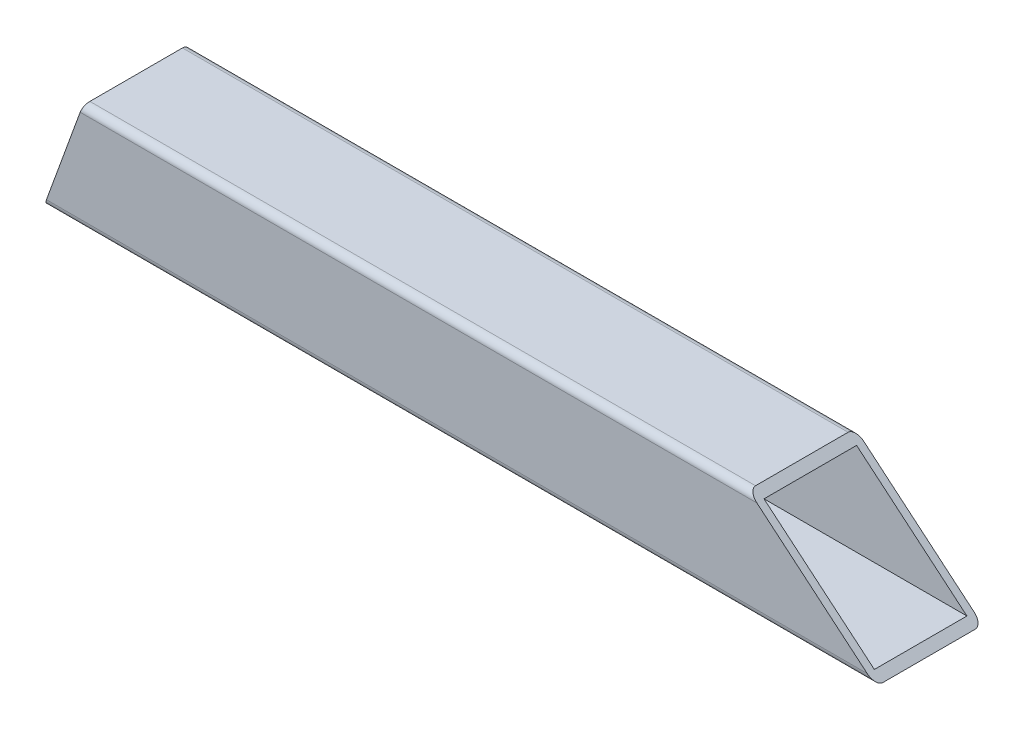
ISO-10303-21;
HEADER;
FILE_DESCRIPTION(('STEP AP214'),'2;1');
FILE_NAME('part.step','',(''),(''),'','','');
FILE_SCHEMA(('AUTOMOTIVE_DESIGN { 1 0 10303 214 1 1 1 1 }'));
ENDSEC;
DATA;
#1=APPLICATION_CONTEXT('core data for automotive mechanical design processes');
#2=APPLICATION_PROTOCOL_DEFINITION('international standard','automotive_design',2000,#1);
#3=PRODUCT_CONTEXT('',#1,'mechanical');
#4=PRODUCT('Part','Part','',(#3));
#5=PRODUCT_RELATED_PRODUCT_CATEGORY('part','',(#4));
#6=PRODUCT_DEFINITION_FORMATION('','',#4);
#7=PRODUCT_DEFINITION_CONTEXT('part definition',#1,'design');
#8=PRODUCT_DEFINITION('design','',#6,#7);
#9=PRODUCT_DEFINITION_SHAPE('','',#8);
#10=(LENGTH_UNIT() NAMED_UNIT(*) SI_UNIT(.MILLI.,.METRE.));
#11=(NAMED_UNIT(*) PLANE_ANGLE_UNIT() SI_UNIT($,.RADIAN.));
#12=(NAMED_UNIT(*) SI_UNIT($,.STERADIAN.) SOLID_ANGLE_UNIT());
#13=UNCERTAINTY_MEASURE_WITH_UNIT(LENGTH_MEASURE(1.E-05),#10,'distance_accuracy_value','');
#14=(GEOMETRIC_REPRESENTATION_CONTEXT(3) GLOBAL_UNCERTAINTY_ASSIGNED_CONTEXT((#13)) GLOBAL_UNIT_ASSIGNED_CONTEXT((#10,
#11,#12)) REPRESENTATION_CONTEXT('',''));
#15=CARTESIAN_POINT('',(0.,0.,0.));
#16=DIRECTION('',(0.,0.,1.));
#17=DIRECTION('',(1.,0.,0.));
#18=AXIS2_PLACEMENT_3D('',#15,#16,#17);
#19=CARTESIAN_POINT('',(1168.00000000001,140.,-9.99999999999979));
#20=DIRECTION('',(-1.00000000000001,0.,0.));
#21=DIRECTION('',(0.,0.,1.));
#22=AXIS2_PLACEMENT_3D('',#19,#20,#21);
#23=CYLINDRICAL_SURFACE('',#22,10.);
#24=CARTESIAN_POINT('',(50.9558327972691,140.,-9.99999999999979));
#25=DIRECTION('',(-0.939692620785912,0.342020143325675,0.));
#26=DIRECTION('',(-0.342020143325674,-0.93969262078591,0.));
#27=AXIS2_PLACEMENT_3D('',#24,#25,#26);
#28=ELLIPSE('',#27,10.6417777247591,10.);
#29=CARTESIAN_POINT('',(50.9558327972691,140.,2.22044604925031E-13));
#30=VERTEX_POINT('',#29);
#31=CARTESIAN_POINT('',(54.5955351399319,150.,-10.0000000000001));
#32=VERTEX_POINT('',#31);
#33=EDGE_CURVE('E48',#30,#32,#28,.T.);
#34=ORIENTED_EDGE('',*,*,#33,.F.);
#35=DIRECTION('',(-1.00000000000001,0.,0.));
#36=VECTOR('',#35,1.);
#37=CARTESIAN_POINT('',(1168.00000000001,140.,2.22044604925031E-13));
#38=LINE('',#37,#36);
#39=CARTESIAN_POINT('',(1001.15449703682,139.999999999999,0.));
#40=VERTEX_POINT('',#39);
#41=EDGE_CURVE('E223',#40,#30,#38,.T.);
#42=ORIENTED_EDGE('',*,*,#41,.F.);
#43=CARTESIAN_POINT('',(1001.15449703682,139.999999999999,-9.99999999999995));
#44=DIRECTION('',(-0.642787609686544,-0.766044443118979,0.));
#45=DIRECTION('',(-0.766044443118981,0.642787609686544,0.));
#46=AXIS2_PLACEMENT_3D('',#43,#44,#45);
#47=ELLIPSE('',#46,15.5572382686041,10.);
#48=CARTESIAN_POINT('',(989.236961110875,149.999999999999,-10.0000000000002));
#49=VERTEX_POINT('',#48);
#50=EDGE_CURVE('E191',#40,#49,#47,.T.);
#51=ORIENTED_EDGE('',*,*,#50,.T.);
#52=DIRECTION('',(-1.00000000000001,0.,0.));
#53=VECTOR('',#52,1.);
#54=CARTESIAN_POINT('',(1168.00000000001,149.999999999999,-9.99999999999984));
#55=LINE('',#54,#53);
#56=EDGE_CURVE('E135',#49,#32,#55,.T.);
#57=ORIENTED_EDGE('',*,*,#56,.T.);
#58=EDGE_LOOP('',(#34,#42,#51,#57));
#59=FACE_BOUND('',#58,.T.);
#60=ADVANCED_FACE('F34',(#59),#23,.T.);
#61=CARTESIAN_POINT('',(1168.00000000001,9.99999999999801,0.));
#62=DIRECTION('',(0.,0.,-1.));
#63=DIRECTION('',(-1.00000000000001,0.,0.));
#64=AXIS2_PLACEMENT_3D('',#61,#62,#63);
#65=PLANE('',#64);
#66=DIRECTION('',(0.342020143325674,0.93969262078591,0.));
#67=VECTOR('',#66,1.);
#68=CARTESIAN_POINT('',(139.843983266953,384.218186272538,0.));
#69=LINE('',#68,#67);
#70=CARTESIAN_POINT('',(3.63970234266242,9.9999999999989,2.22044604925031E-13));
#71=VERTEX_POINT('',#70);
#72=EDGE_CURVE('E55',#71,#30,#69,.T.);
#73=ORIENTED_EDGE('',*,*,#72,.F.);
#74=DIRECTION('',(-1.00000000000001,0.,0.));
#75=VECTOR('',#74,1.);
#76=CARTESIAN_POINT('',(1168.00000000001,9.99999999999801,0.));
#77=LINE('',#76,#75);
#78=CARTESIAN_POINT('',(1156.08246407406,9.99999999999801,0.));
#79=VERTEX_POINT('',#78);
#80=EDGE_CURVE('E221',#79,#71,#77,.T.);
#81=ORIENTED_EDGE('',*,*,#80,.F.);
#82=DIRECTION('',(-0.766044443118981,0.642787609686544,0.));
#83=VECTOR('',#82,1.);
#84=CARTESIAN_POINT('',(1163.07596123495,4.13175911166408,0.));
#85=LINE('',#84,#83);
#86=EDGE_CURVE('E188',#79,#40,#85,.T.);
#87=ORIENTED_EDGE('',*,*,#86,.T.);
#88=ORIENTED_EDGE('',*,*,#41,.T.);
#89=EDGE_LOOP('',(#73,#81,#87,#88));
#90=FACE_BOUND('',#89,.T.);
#91=ADVANCED_FACE('F251',(#90),#65,.F.);
#92=CARTESIAN_POINT('',(1168.00000000001,9.99999999999801,-10.));
#93=DIRECTION('',(-1.00000000000001,0.,0.));
#94=DIRECTION('',(0.,0.,1.));
#95=AXIS2_PLACEMENT_3D('',#92,#93,#94);
#96=CYLINDRICAL_SURFACE('',#95,10.);
#97=CARTESIAN_POINT('',(3.63970234266242,9.9999999999989,-9.99999999999979));
#98=DIRECTION('',(-0.939692620785912,0.342020143325675,0.));
#99=DIRECTION('',(-0.342020143325674,-0.93969262078591,0.));
#100=AXIS2_PLACEMENT_3D('',#97,#98,#99);
#101=ELLIPSE('',#100,10.6417777247591,10.);
#102=CARTESIAN_POINT('',(0.,0.,-10.0000000000001));
#103=VERTEX_POINT('',#102);
#104=EDGE_CURVE('E162',#103,#71,#101,.T.);
#105=ORIENTED_EDGE('',*,*,#104,.F.);
#106=DIRECTION('',(-1.00000000000001,0.,0.));
#107=VECTOR('',#106,1.);
#108=CARTESIAN_POINT('',(1168.00000000001,-1.77635683940025E-12,-10.0000000000003));
#109=LINE('',#108,#107);
#110=CARTESIAN_POINT('',(1168.00000000001,-1.77635683940025E-12,-10.0000000000002));
#111=VERTEX_POINT('',#110);
#112=EDGE_CURVE('E218',#111,#103,#109,.T.);
#113=ORIENTED_EDGE('',*,*,#112,.F.);
#114=CARTESIAN_POINT('',(1156.08246407406,9.99999999999845,-10.));
#115=DIRECTION('',(-0.642787609686544,-0.766044443118979,0.));
#116=DIRECTION('',(-0.766044443118981,0.642787609686544,0.));
#117=AXIS2_PLACEMENT_3D('',#114,#115,#116);
#118=ELLIPSE('',#117,15.5572382686041,10.);
#119=EDGE_CURVE('E185',#111,#79,#118,.T.);
#120=ORIENTED_EDGE('',*,*,#119,.T.);
#121=ORIENTED_EDGE('',*,*,#80,.T.);
#122=EDGE_LOOP('',(#105,#113,#120,#121));
#123=FACE_BOUND('',#122,.T.);
#124=ADVANCED_FACE('F255',(#123),#96,.T.);
#125=CARTESIAN_POINT('',(1168.00000000001,9.99999999999779,-140.000000000001));
#126=DIRECTION('',(-1.00000000000001,0.,0.));
#127=DIRECTION('',(0.,0.,1.));
#128=AXIS2_PLACEMENT_3D('',#125,#126,#127);
#129=CYLINDRICAL_SURFACE('',#128,10.);
#130=CARTESIAN_POINT('',(3.63970234266242,9.9999999999989,-140.));
#131=DIRECTION('',(-0.939692620785912,0.342020143325675,0.));
#132=DIRECTION('',(-0.342020143325674,-0.93969262078591,0.));
#133=AXIS2_PLACEMENT_3D('',#130,#131,#132);
#134=ELLIPSE('',#133,10.6417777247591,10.);
#135=CARTESIAN_POINT('',(3.63970234266242,9.9999999999989,-150.));
#136=VERTEX_POINT('',#135);
#137=CARTESIAN_POINT('',(2.22044604925031E-13,-8.88178419700125E-13,-140.));
#138=VERTEX_POINT('',#137);
#139=EDGE_CURVE('E159',#136,#138,#134,.T.);
#140=ORIENTED_EDGE('',*,*,#139,.F.);
#141=DIRECTION('',(-1.00000000000001,0.,0.));
#142=VECTOR('',#141,1.);
#143=CARTESIAN_POINT('',(1168.00000000001,9.99999999999801,-150.000000000001));
#144=LINE('',#143,#142);
#145=CARTESIAN_POINT('',(1156.08246407406,9.99999999999823,-150.));
#146=VERTEX_POINT('',#145);
#147=EDGE_CURVE('E212',#146,#136,#144,.T.);
#148=ORIENTED_EDGE('',*,*,#147,.F.);
#149=CARTESIAN_POINT('',(1156.08246407406,9.99999999999868,-140.));
#150=DIRECTION('',(-0.642787609686544,-0.766044443118979,0.));
#151=DIRECTION('',(-0.766044443118981,0.642787609686544,0.));
#152=AXIS2_PLACEMENT_3D('',#149,#150,#151);
#153=ELLIPSE('',#152,15.5572382686041,10.);
#154=CARTESIAN_POINT('',(1168.00000000001,-1.99840144432528E-12,-140.));
#155=VERTEX_POINT('',#154);
#156=EDGE_CURVE('E182',#146,#155,#153,.T.);
#157=ORIENTED_EDGE('',*,*,#156,.T.);
#158=DIRECTION('',(-1.00000000000001,0.,0.));
#159=VECTOR('',#158,1.);
#160=CARTESIAN_POINT('',(1168.00000000001,-1.99840144432528E-12,-140.));
#161=LINE('',#160,#159);
#162=EDGE_CURVE('E215',#155,#138,#161,.T.);
#163=ORIENTED_EDGE('',*,*,#162,.T.);
#164=EDGE_LOOP('',(#140,#148,#157,#163));
#165=FACE_BOUND('',#164,.T.);
#166=ADVANCED_FACE('F259',(#165),#129,.T.);
#167=CARTESIAN_POINT('',(1168.00000000001,9.99999999999801,-150.000000000001));
#168=DIRECTION('',(0.,0.,1.));
#169=DIRECTION('',(1.00000000000001,0.,0.));
#170=AXIS2_PLACEMENT_3D('',#167,#168,#169);
#171=PLANE('',#170);
#172=DIRECTION('',(-0.342020143325674,-0.93969262078591,0.));
#173=VECTOR('',#172,1.);
#174=CARTESIAN_POINT('',(139.843983266953,384.218186272538,-150.));
#175=LINE('',#174,#173);
#176=CARTESIAN_POINT('',(50.9558327972699,139.999999999999,-150.));
#177=VERTEX_POINT('',#176);
#178=EDGE_CURVE('E144',#177,#136,#175,.T.);
#179=ORIENTED_EDGE('',*,*,#178,.F.);
#180=DIRECTION('',(-1.00000000000001,0.,0.));
#181=VECTOR('',#180,1.);
#182=CARTESIAN_POINT('',(1168.00000000001,139.999999999999,-150.));
#183=LINE('',#182,#181);
#184=CARTESIAN_POINT('',(1001.15449703682,139.999999999999,-150.));
#185=VERTEX_POINT('',#184);
#186=EDGE_CURVE('E134',#185,#177,#183,.T.);
#187=ORIENTED_EDGE('',*,*,#186,.F.);
#188=DIRECTION('',(0.766044443118981,-0.642787609686544,0.));
#189=VECTOR('',#188,1.);
#190=CARTESIAN_POINT('',(1163.07596123495,4.13175911166341,-150.));
#191=LINE('',#190,#189);
#192=EDGE_CURVE('E179',#185,#146,#191,.T.);
#193=ORIENTED_EDGE('',*,*,#192,.T.);
#194=ORIENTED_EDGE('',*,*,#147,.T.);
#195=EDGE_LOOP('',(#179,#187,#193,#194));
#196=FACE_BOUND('',#195,.T.);
#197=ADVANCED_FACE('F268',(#196),#171,.F.);
#198=CARTESIAN_POINT('',(1168.00000000001,139.999999999999,-140.));
#199=DIRECTION('',(-1.00000000000001,0.,0.));
#200=DIRECTION('',(0.,0.,1.));
#201=AXIS2_PLACEMENT_3D('',#198,#199,#200);
#202=CYLINDRICAL_SURFACE('',#201,10.);
#203=CARTESIAN_POINT('',(50.9558327972699,139.999999999999,-140.));
#204=DIRECTION('',(-0.939692620785912,0.342020143325675,0.));
#205=DIRECTION('',(-0.342020143325674,-0.93969262078591,0.));
#206=AXIS2_PLACEMENT_3D('',#203,#204,#205);
#207=ELLIPSE('',#206,10.6417777247591,10.);
#208=CARTESIAN_POINT('',(54.5955351399322,149.999999999999,-140.));
#209=VERTEX_POINT('',#208);
#210=EDGE_CURVE('E139',#209,#177,#207,.T.);
#211=ORIENTED_EDGE('',*,*,#210,.F.);
#212=DIRECTION('',(-1.00000000000001,0.,0.));
#213=VECTOR('',#212,1.);
#214=CARTESIAN_POINT('',(1168.00000000001,149.999999999999,-140.));
#215=LINE('',#214,#213);
#216=CARTESIAN_POINT('',(989.236961110876,149.999999999998,-140.));
#217=VERTEX_POINT('',#216);
#218=EDGE_CURVE('E125',#217,#209,#215,.T.);
#219=ORIENTED_EDGE('',*,*,#218,.F.);
#220=CARTESIAN_POINT('',(1001.15449703682,139.999999999999,-140.));
#221=DIRECTION('',(-0.642787609686544,-0.766044443118979,0.));
#222=DIRECTION('',(-0.766044443118981,0.642787609686544,0.));
#223=AXIS2_PLACEMENT_3D('',#220,#221,#222);
#224=ELLIPSE('',#223,15.5572382686041,10.);
#225=EDGE_CURVE('E177',#217,#185,#224,.T.);
#226=ORIENTED_EDGE('',*,*,#225,.T.);
#227=ORIENTED_EDGE('',*,*,#186,.T.);
#228=EDGE_LOOP('',(#211,#219,#226,#227));
#229=FACE_BOUND('',#228,.T.);
#230=ADVANCED_FACE('F140',(#229),#202,.T.);
#231=CARTESIAN_POINT('',(1168.00000000001,149.999999999999,-9.99999999999984));
#232=DIRECTION('',(0.,-1.,0.));
#233=DIRECTION('',(0.,0.,-1.));
#234=AXIS2_PLACEMENT_3D('',#231,#232,#233);
#235=PLANE('',#234);
#236=DIRECTION('',(0.,0.,-1.));
#237=VECTOR('',#236,1.);
#238=CARTESIAN_POINT('',(54.5955351399312,150.,1496.38426098534));
#239=LINE('',#238,#237);
#240=EDGE_CURVE('E130',#32,#209,#239,.T.);
#241=ORIENTED_EDGE('',*,*,#240,.F.);
#242=ORIENTED_EDGE('',*,*,#56,.F.);
#243=DIRECTION('',(0.,0.,-1.));
#244=VECTOR('',#243,1.);
#245=CARTESIAN_POINT('',(989.236961110874,149.999999999999,1483.88426098534));
#246=LINE('',#245,#244);
#247=EDGE_CURVE('E131',#49,#217,#246,.T.);
#248=ORIENTED_EDGE('',*,*,#247,.T.);
#249=ORIENTED_EDGE('',*,*,#218,.T.);
#250=EDGE_LOOP('',(#241,#242,#248,#249));
#251=FACE_BOUND('',#250,.T.);
#252=ADVANCED_FACE('F127',(#251),#235,.F.);
#253=CARTESIAN_POINT('',(1168.00000000001,9.99999999999801,-10.));
#254=DIRECTION('',(0.,1.,0.));
#255=DIRECTION('',(0.,0.,1.));
#256=AXIS2_PLACEMENT_3D('',#253,#254,#255);
#257=PLANE('',#256);
#258=DIRECTION('',(-1.00000000000001,0.,0.));
#259=VECTOR('',#258,1.);
#260=CARTESIAN_POINT('',(1168.00000000001,9.99999999999779,-140.000000000001));
#261=LINE('',#260,#259);
#262=CARTESIAN_POINT('',(1156.08246407406,9.99999999999868,-140.));
#263=VERTEX_POINT('',#262);
#264=CARTESIAN_POINT('',(3.63970234266242,9.9999999999989,-140.));
#265=VERTEX_POINT('',#264);
#266=EDGE_CURVE('E203',#263,#265,#261,.T.);
#267=ORIENTED_EDGE('',*,*,#266,.T.);
#268=DIRECTION('',(0.,0.,1.));
#269=VECTOR('',#268,1.);
#270=CARTESIAN_POINT('',(3.63970234266242,9.9999999999989,-9.99999999999979));
#271=LINE('',#270,#269);
#272=CARTESIAN_POINT('',(3.6397023426622,10.,-9.99999999999979));
#273=VERTEX_POINT('',#272);
#274=EDGE_CURVE('E145',#265,#273,#271,.T.);
#275=ORIENTED_EDGE('',*,*,#274,.T.);
#276=DIRECTION('',(-1.00000000000001,0.,0.));
#277=VECTOR('',#276,1.);
#278=CARTESIAN_POINT('',(1168.00000000001,9.99999999999801,-10.));
#279=LINE('',#278,#277);
#280=CARTESIAN_POINT('',(1156.08246407406,9.99999999999845,-10.));
#281=VERTEX_POINT('',#280);
#282=EDGE_CURVE('E194',#281,#273,#279,.T.);
#283=ORIENTED_EDGE('',*,*,#282,.F.);
#284=DIRECTION('',(0.,0.,1.));
#285=VECTOR('',#284,1.);
#286=CARTESIAN_POINT('',(1156.08246407406,9.99999999999845,-10.));
#287=LINE('',#286,#285);
#288=EDGE_CURVE('E174',#263,#281,#287,.T.);
#289=ORIENTED_EDGE('',*,*,#288,.F.);
#290=EDGE_LOOP('',(#267,#275,#283,#289));
#291=FACE_BOUND('',#290,.T.);
#292=ADVANCED_FACE('F233',(#291),#257,.T.);
#293=CARTESIAN_POINT('',(1168.00000000001,9.99999999999779,-140.000000000001));
#294=DIRECTION('',(0.,0.,1.));
#295=DIRECTION('',(1.00000000000001,0.,0.));
#296=AXIS2_PLACEMENT_3D('',#293,#294,#295);
#297=PLANE('',#296);
#298=DIRECTION('',(-1.00000000000001,0.,0.));
#299=VECTOR('',#298,1.);
#300=CARTESIAN_POINT('',(1168.00000000001,139.999999999999,-140.));
#301=LINE('',#300,#299);
#302=CARTESIAN_POINT('',(1001.15449703682,139.999999999999,-140.));
#303=VERTEX_POINT('',#302);
#304=CARTESIAN_POINT('',(50.9558327972699,139.999999999999,-140.));
#305=VERTEX_POINT('',#304);
#306=EDGE_CURVE('E200',#303,#305,#301,.T.);
#307=ORIENTED_EDGE('',*,*,#306,.T.);
#308=DIRECTION('',(-0.342020143325674,-0.93969262078591,0.));
#309=VECTOR('',#308,1.);
#310=CARTESIAN_POINT('',(139.843983266954,384.218186272538,-140.));
#311=LINE('',#310,#309);
#312=EDGE_CURVE('E151',#305,#265,#311,.T.);
#313=ORIENTED_EDGE('',*,*,#312,.T.);
#314=ORIENTED_EDGE('',*,*,#266,.F.);
#315=DIRECTION('',(0.766044443118981,-0.642787609686544,0.));
#316=VECTOR('',#315,1.);
#317=CARTESIAN_POINT('',(1163.07596123495,4.13175911166341,-140.));
#318=LINE('',#317,#316);
#319=EDGE_CURVE('E171',#303,#263,#318,.T.);
#320=ORIENTED_EDGE('',*,*,#319,.F.);
#321=EDGE_LOOP('',(#307,#313,#314,#320));
#322=FACE_BOUND('',#321,.T.);
#323=ADVANCED_FACE('F237',(#322),#297,.T.);
#324=CARTESIAN_POINT('',(1168.00000000001,140.,-9.99999999999979));
#325=DIRECTION('',(0.,-1.,0.));
#326=DIRECTION('',(0.,0.,-1.));
#327=AXIS2_PLACEMENT_3D('',#324,#325,#326);
#328=PLANE('',#327);
#329=DIRECTION('',(-1.00000000000001,0.,0.));
#330=VECTOR('',#329,1.);
#331=CARTESIAN_POINT('',(1168.00000000001,140.,-9.99999999999979));
#332=LINE('',#331,#330);
#333=CARTESIAN_POINT('',(1001.15449703682,139.999999999999,-9.99999999999995));
#334=VERTEX_POINT('',#333);
#335=CARTESIAN_POINT('',(50.9558327972691,140.,-9.99999999999979));
#336=VERTEX_POINT('',#335);
#337=EDGE_CURVE('E197',#334,#336,#332,.T.);
#338=ORIENTED_EDGE('',*,*,#337,.T.);
#339=DIRECTION('',(0.,0.,-1.));
#340=VECTOR('',#339,1.);
#341=CARTESIAN_POINT('',(50.9558327972691,140.,-9.99999999999979));
#342=LINE('',#341,#340);
#343=EDGE_CURVE('E148',#336,#305,#342,.T.);
#344=ORIENTED_EDGE('',*,*,#343,.T.);
#345=ORIENTED_EDGE('',*,*,#306,.F.);
#346=DIRECTION('',(0.,0.,-1.));
#347=VECTOR('',#346,1.);
#348=CARTESIAN_POINT('',(1001.15449703682,139.999999999999,-9.99999999999995));
#349=LINE('',#348,#347);
#350=EDGE_CURVE('E168',#334,#303,#349,.T.);
#351=ORIENTED_EDGE('',*,*,#350,.F.);
#352=EDGE_LOOP('',(#338,#344,#345,#351));
#353=FACE_BOUND('',#352,.T.);
#354=ADVANCED_FACE('F240',(#353),#328,.T.);
#355=CARTESIAN_POINT('',(1168.00000000001,9.99999999999801,-10.));
#356=DIRECTION('',(0.,0.,-1.));
#357=DIRECTION('',(-1.00000000000001,0.,0.));
#358=AXIS2_PLACEMENT_3D('',#355,#356,#357);
#359=PLANE('',#358);
#360=ORIENTED_EDGE('',*,*,#282,.T.);
#361=DIRECTION('',(0.342020143325674,0.93969262078591,0.));
#362=VECTOR('',#361,1.);
#363=CARTESIAN_POINT('',(139.843983266954,384.218186272538,-9.99999999999995));
#364=LINE('',#363,#362);
#365=EDGE_CURVE('E11',#273,#336,#364,.T.);
#366=ORIENTED_EDGE('',*,*,#365,.T.);
#367=ORIENTED_EDGE('',*,*,#337,.F.);
#368=DIRECTION('',(-0.766044443118981,0.642787609686544,0.));
#369=VECTOR('',#368,1.);
#370=CARTESIAN_POINT('',(1163.07596123495,4.13175911166408,-10.));
#371=LINE('',#370,#369);
#372=EDGE_CURVE('E41',#281,#334,#371,.T.);
#373=ORIENTED_EDGE('',*,*,#372,.F.);
#374=EDGE_LOOP('',(#360,#366,#367,#373));
#375=FACE_BOUND('',#374,.T.);
#376=ADVANCED_FACE('F231',(#375),#359,.T.);
#377=CARTESIAN_POINT('',(1168.00000000001,-1.77635683940025E-12,-10.0000000000003));
#378=DIRECTION('',(0.,1.,0.));
#379=DIRECTION('',(0.,0.,1.));
#380=AXIS2_PLACEMENT_3D('',#377,#378,#379);
#381=PLANE('',#380);
#382=DIRECTION('',(0.,0.,-1.));
#383=VECTOR('',#382,1.);
#384=CARTESIAN_POINT('',(0.,0.,-10.0000000000001));
#385=LINE('',#384,#383);
#386=EDGE_CURVE('E206',#103,#138,#385,.T.);
#387=ORIENTED_EDGE('',*,*,#386,.T.);
#388=ORIENTED_EDGE('',*,*,#162,.F.);
#389=DIRECTION('',(0.,0.,-1.));
#390=VECTOR('',#389,1.);
#391=CARTESIAN_POINT('',(1168.00000000001,-1.77635683940025E-12,-10.0000000000003));
#392=LINE('',#391,#390);
#393=EDGE_CURVE('E208',#111,#155,#392,.T.);
#394=ORIENTED_EDGE('',*,*,#393,.F.);
#395=ORIENTED_EDGE('',*,*,#112,.T.);
#396=EDGE_LOOP('',(#387,#388,#394,#395));
#397=FACE_BOUND('',#396,.T.);
#398=ADVANCED_FACE('F247',(#397),#381,.F.);
#399=CARTESIAN_POINT('',(1168.00000000001,-2.22044604925031E-12,1483.88426098534));
#400=DIRECTION('',(-0.642787609686544,-0.766044443118979,0.));
#401=DIRECTION('',(0.766044443118981,-0.642787609686544,0.));
#402=AXIS2_PLACEMENT_3D('',#399,#400,#401);
#403=PLANE('',#402);
#404=ORIENTED_EDGE('',*,*,#319,.T.);
#405=ORIENTED_EDGE('',*,*,#288,.T.);
#406=ORIENTED_EDGE('',*,*,#372,.T.);
#407=ORIENTED_EDGE('',*,*,#350,.T.);
#408=EDGE_LOOP('',(#404,#405,#406,#407));
#409=FACE_BOUND('',#408,.T.);
#410=ORIENTED_EDGE('',*,*,#50,.F.);
#411=ORIENTED_EDGE('',*,*,#86,.F.);
#412=ORIENTED_EDGE('',*,*,#119,.F.);
#413=ORIENTED_EDGE('',*,*,#393,.T.);
#414=ORIENTED_EDGE('',*,*,#156,.F.);
#415=ORIENTED_EDGE('',*,*,#192,.F.);
#416=ORIENTED_EDGE('',*,*,#225,.F.);
#417=ORIENTED_EDGE('',*,*,#247,.F.);
#418=EDGE_LOOP('',(#410,#411,#412,#413,#414,#415,#416,#417));
#419=FACE_BOUND('',#418,.T.);
#420=ADVANCED_FACE('F226',(#409,#419),#403,.F.);
#421=CARTESIAN_POINT('',(5.55111512312578E-13,-8.88178419700125E-13,1496.38426098534));
#422=DIRECTION('',(-0.939692620785912,0.342020143325675,0.));
#423=DIRECTION('',(-0.342020143325674,-0.93969262078591,0.));
#424=AXIS2_PLACEMENT_3D('',#421,#422,#423);
#425=PLANE('',#424);
#426=ORIENTED_EDGE('',*,*,#274,.F.);
#427=ORIENTED_EDGE('',*,*,#312,.F.);
#428=ORIENTED_EDGE('',*,*,#343,.F.);
#429=ORIENTED_EDGE('',*,*,#365,.F.);
#430=EDGE_LOOP('',(#426,#427,#428,#429));
#431=FACE_BOUND('',#430,.T.);
#432=ORIENTED_EDGE('',*,*,#72,.T.);
#433=ORIENTED_EDGE('',*,*,#33,.T.);
#434=ORIENTED_EDGE('',*,*,#240,.T.);
#435=ORIENTED_EDGE('',*,*,#210,.T.);
#436=ORIENTED_EDGE('',*,*,#178,.T.);
#437=ORIENTED_EDGE('',*,*,#139,.T.);
#438=ORIENTED_EDGE('',*,*,#386,.F.);
#439=ORIENTED_EDGE('',*,*,#104,.T.);
#440=EDGE_LOOP('',(#432,#433,#434,#435,#436,#437,#438,#439));
#441=FACE_BOUND('',#440,.T.);
#442=ADVANCED_FACE('F147',(#431,#441),#425,.T.);
#443=CLOSED_SHELL('',(#60,#91,#124,#166,#197,#230,#252,#292,#323,#354,#376,#398,#420,#442));
#444=MANIFOLD_SOLID_BREP('B2',#443);
#445=ADVANCED_BREP_SHAPE_REPRESENTATION('',(#18,#444),#14);
#446=SHAPE_DEFINITION_REPRESENTATION(#9,#445);
ENDSEC;
END-ISO-10303-21;
